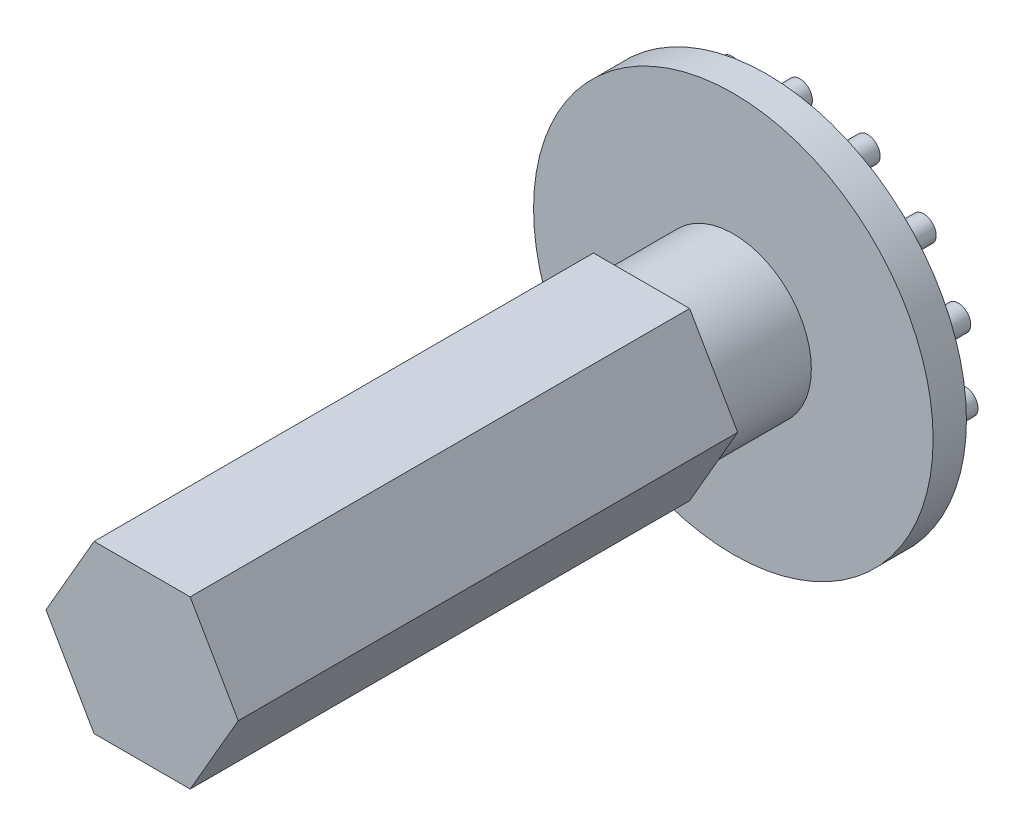
ISO-10303-21;
HEADER;
FILE_DESCRIPTION(('STEP AP214'),'2;1');
FILE_NAME('part.step','',(''),(''),'','','');
FILE_SCHEMA(('AUTOMOTIVE_DESIGN { 1 0 10303 214 1 1 1 1 }'));
ENDSEC;
DATA;
#1=APPLICATION_CONTEXT('core data for automotive mechanical design processes');
#2=APPLICATION_PROTOCOL_DEFINITION('international standard','automotive_design',2000,#1);
#3=PRODUCT_CONTEXT('',#1,'mechanical');
#4=PRODUCT('Part','Part','',(#3));
#5=PRODUCT_RELATED_PRODUCT_CATEGORY('part','',(#4));
#6=PRODUCT_DEFINITION_FORMATION('','',#4);
#7=PRODUCT_DEFINITION_CONTEXT('part definition',#1,'design');
#8=PRODUCT_DEFINITION('design','',#6,#7);
#9=PRODUCT_DEFINITION_SHAPE('','',#8);
#10=(LENGTH_UNIT() NAMED_UNIT(*) SI_UNIT(.MILLI.,.METRE.));
#11=(NAMED_UNIT(*) PLANE_ANGLE_UNIT() SI_UNIT($,.RADIAN.));
#12=(NAMED_UNIT(*) SI_UNIT($,.STERADIAN.) SOLID_ANGLE_UNIT());
#13=UNCERTAINTY_MEASURE_WITH_UNIT(LENGTH_MEASURE(1.E-05),#10,'distance_accuracy_value','');
#14=(GEOMETRIC_REPRESENTATION_CONTEXT(3) GLOBAL_UNCERTAINTY_ASSIGNED_CONTEXT((#13)) GLOBAL_UNIT_ASSIGNED_CONTEXT((#10,
#11,#12)) REPRESENTATION_CONTEXT('',''));
#15=CARTESIAN_POINT('',(0.,0.,0.));
#16=DIRECTION('',(0.,0.,1.));
#17=DIRECTION('',(1.,0.,0.));
#18=AXIS2_PLACEMENT_3D('',#15,#16,#17);
#19=CARTESIAN_POINT('',(0.,0.,2.54));
#20=DIRECTION('',(0.,0.,1.));
#21=DIRECTION('',(1.,0.,0.));
#22=AXIS2_PLACEMENT_3D('',#19,#20,#21);
#23=PLANE('',#22);
#24=CARTESIAN_POINT('',(0.,0.,2.54));
#25=DIRECTION('',(0.,0.,1.));
#26=DIRECTION('',(1.,0.,0.));
#27=AXIS2_PLACEMENT_3D('',#24,#25,#26);
#28=CIRCLE('',#27,5.95);
#29=CARTESIAN_POINT('',(5.95,0.,2.54));
#30=VERTEX_POINT('',#29);
#31=EDGE_CURVE('E172',#30,#30,#28,.T.);
#32=ORIENTED_EDGE('',*,*,#31,.F.);
#33=EDGE_LOOP('',(#32));
#34=FACE_BOUND('',#33,.T.);
#35=CARTESIAN_POINT('',(0.,0.,2.54));
#36=DIRECTION('',(0.,0.,1.));
#37=DIRECTION('',(1.,0.,0.));
#38=AXIS2_PLACEMENT_3D('',#35,#36,#37);
#39=CIRCLE('',#38,15.24);
#40=CARTESIAN_POINT('',(15.24,0.,2.54));
#41=VERTEX_POINT('',#40);
#42=EDGE_CURVE('E189',#41,#41,#39,.T.);
#43=ORIENTED_EDGE('',*,*,#42,.T.);
#44=EDGE_LOOP('',(#43));
#45=FACE_BOUND('',#44,.T.);
#46=ADVANCED_FACE('F47',(#34,#45),#23,.T.);
#47=CARTESIAN_POINT('',(0.,0.,0.));
#48=DIRECTION('',(0.,0.,1.));
#49=DIRECTION('',(1.,0.,0.));
#50=AXIS2_PLACEMENT_3D('',#47,#48,#49);
#51=PLANE('',#50);
#52=CARTESIAN_POINT('',(5.1655553670626,11.6020273120607,0.));
#53=DIRECTION('',(0.,0.,1.));
#54=DIRECTION('',(1.,0.,0.));
#55=AXIS2_PLACEMENT_3D('',#52,#53,#54);
#56=CIRCLE('',#55,0.952500000000296);
#57=CARTESIAN_POINT('',(6.1180553670629,11.6020273120607,0.));
#58=VERTEX_POINT('',#57);
#59=EDGE_CURVE('E11',#58,#58,#56,.F.);
#60=ORIENTED_EDGE('',*,*,#59,.F.);
#61=EDGE_LOOP('',(#60));
#62=FACE_BOUND('',#61,.T.);
#63=CARTESIAN_POINT('',(9.43793928356291,8.4979587007575,0.));
#64=DIRECTION('',(0.,0.,1.));
#65=DIRECTION('',(1.,0.,0.));
#66=AXIS2_PLACEMENT_3D('',#63,#64,#65);
#67=CIRCLE('',#66,0.952500000000151);
#68=CARTESIAN_POINT('',(10.3904392835631,8.4979587007575,0.));
#69=VERTEX_POINT('',#68);
#70=EDGE_CURVE('E57',#69,#69,#67,.F.);
#71=ORIENTED_EDGE('',*,*,#70,.F.);
#72=EDGE_LOOP('',(#71));
#73=FACE_BOUND('',#72,.T.);
#74=CARTESIAN_POINT('',(12.0784177569485,3.92451582856183,0.));
#75=DIRECTION('',(0.,0.,1.));
#76=DIRECTION('',(1.,0.,0.));
#77=AXIS2_PLACEMENT_3D('',#74,#75,#76);
#78=CIRCLE('',#77,0.95250000000013);
#79=CARTESIAN_POINT('',(13.0309177569486,3.92451582856183,0.));
#80=VERTEX_POINT('',#79);
#81=EDGE_CURVE('E238',#80,#80,#78,.F.);
#82=ORIENTED_EDGE('',*,*,#81,.F.);
#83=EDGE_LOOP('',(#82));
#84=FACE_BOUND('',#83,.T.);
#85=CARTESIAN_POINT('',(12.6304280711771,-1.32751148349921,0.));
#86=DIRECTION('',(0.,0.,1.));
#87=DIRECTION('',(1.,0.,0.));
#88=AXIS2_PLACEMENT_3D('',#85,#86,#87);
#89=CIRCLE('',#88,0.952500000000129);
#90=CARTESIAN_POINT('',(13.5829280711772,-1.32751148349921,0.));
#91=VERTEX_POINT('',#90);
#92=EDGE_CURVE('E235',#91,#91,#89,.F.);
#93=ORIENTED_EDGE('',*,*,#92,.F.);
#94=EDGE_LOOP('',(#93));
#95=FACE_BOUND('',#94,.T.);
#96=CARTESIAN_POINT('',(10.9985226280624,-6.35000000000001,0.));
#97=DIRECTION('',(0.,0.,1.));
#98=DIRECTION('',(1.,0.,0.));
#99=AXIS2_PLACEMENT_3D('',#96,#97,#98);
#100=CIRCLE('',#99,0.952500000000119);
#101=CARTESIAN_POINT('',(11.9510226280625,-6.35000000000001,0.));
#102=VERTEX_POINT('',#101);
#103=EDGE_CURVE('E232',#102,#102,#100,.F.);
#104=ORIENTED_EDGE('',*,*,#103,.F.);
#105=EDGE_LOOP('',(#104));
#106=FACE_BOUND('',#105,.T.);
#107=CARTESIAN_POINT('',(7.46487270411441,-10.2745158285618,0.));
#108=DIRECTION('',(0.,0.,1.));
#109=DIRECTION('',(1.,0.,0.));
#110=AXIS2_PLACEMENT_3D('',#107,#108,#109);
#111=CIRCLE('',#110,0.952500000000104);
#112=CARTESIAN_POINT('',(8.41737270411451,-10.2745158285618,0.));
#113=VERTEX_POINT('',#112);
#114=EDGE_CURVE('E229',#113,#113,#111,.F.);
#115=ORIENTED_EDGE('',*,*,#114,.F.);
#116=EDGE_LOOP('',(#115));
#117=FACE_BOUND('',#116,.T.);
#118=CARTESIAN_POINT('',(2.64047847338554,-12.4224745293193,0.));
#119=DIRECTION('',(0.,0.,1.));
#120=DIRECTION('',(1.,0.,0.));
#121=AXIS2_PLACEMENT_3D('',#118,#119,#120);
#122=CIRCLE('',#121,0.952500000000092);
#123=CARTESIAN_POINT('',(3.59297847338563,-12.4224745293193,0.));
#124=VERTEX_POINT('',#123);
#125=EDGE_CURVE('E226',#124,#124,#122,.F.);
#126=ORIENTED_EDGE('',*,*,#125,.F.);
#127=EDGE_LOOP('',(#126));
#128=FACE_BOUND('',#127,.T.);
#129=CARTESIAN_POINT('',(-2.64047847338555,-12.4224745293193,0.));
#130=DIRECTION('',(0.,0.,1.));
#131=DIRECTION('',(1.,0.,0.));
#132=AXIS2_PLACEMENT_3D('',#129,#130,#131);
#133=CIRCLE('',#132,0.95250000000008);
#134=CARTESIAN_POINT('',(-1.68797847338547,-12.4224745293193,0.));
#135=VERTEX_POINT('',#134);
#136=EDGE_CURVE('E223',#135,#135,#133,.F.);
#137=ORIENTED_EDGE('',*,*,#136,.F.);
#138=EDGE_LOOP('',(#137));
#139=FACE_BOUND('',#138,.T.);
#140=CARTESIAN_POINT('',(-7.46487270411441,-10.2745158285618,0.));
#141=DIRECTION('',(0.,0.,1.));
#142=DIRECTION('',(1.,0.,0.));
#143=AXIS2_PLACEMENT_3D('',#140,#141,#142);
#144=CIRCLE('',#143,0.952500000000065);
#145=CARTESIAN_POINT('',(-6.51237270411434,-10.2745158285618,0.));
#146=VERTEX_POINT('',#145);
#147=EDGE_CURVE('E220',#146,#146,#144,.F.);
#148=ORIENTED_EDGE('',*,*,#147,.F.);
#149=EDGE_LOOP('',(#148));
#150=FACE_BOUND('',#149,.T.);
#151=CARTESIAN_POINT('',(-10.9985226280624,-6.35,0.));
#152=DIRECTION('',(0.,0.,1.));
#153=DIRECTION('',(1.,0.,0.));
#154=AXIS2_PLACEMENT_3D('',#151,#152,#153);
#155=CIRCLE('',#154,0.952500000000058);
#156=CARTESIAN_POINT('',(-10.0460226280623,-6.35,0.));
#157=VERTEX_POINT('',#156);
#158=EDGE_CURVE('E216',#157,#157,#155,.F.);
#159=ORIENTED_EDGE('',*,*,#158,.F.);
#160=EDGE_LOOP('',(#159));
#161=FACE_BOUND('',#160,.T.);
#162=CARTESIAN_POINT('',(-12.6304280711771,-1.3275114834992,0.));
#163=DIRECTION('',(0.,0.,1.));
#164=DIRECTION('',(1.,0.,0.));
#165=AXIS2_PLACEMENT_3D('',#162,#163,#164);
#166=CIRCLE('',#165,0.952500000000045);
#167=CARTESIAN_POINT('',(-11.677928071177,-1.3275114834992,0.));
#168=VERTEX_POINT('',#167);
#169=EDGE_CURVE('E212',#168,#168,#166,.F.);
#170=ORIENTED_EDGE('',*,*,#169,.F.);
#171=EDGE_LOOP('',(#170));
#172=FACE_BOUND('',#171,.T.);
#173=CARTESIAN_POINT('',(-12.0784177569485,3.92451582856183,0.));
#174=DIRECTION('',(0.,0.,1.));
#175=DIRECTION('',(1.,0.,0.));
#176=AXIS2_PLACEMENT_3D('',#173,#174,#175);
#177=CIRCLE('',#176,0.952500000000032);
#178=CARTESIAN_POINT('',(-11.1259177569484,3.92451582856183,0.));
#179=VERTEX_POINT('',#178);
#180=EDGE_CURVE('E208',#179,#179,#177,.F.);
#181=ORIENTED_EDGE('',*,*,#180,.F.);
#182=EDGE_LOOP('',(#181));
#183=FACE_BOUND('',#182,.T.);
#184=CARTESIAN_POINT('',(-9.43793928356291,8.4979587007575,0.));
#185=DIRECTION('',(0.,0.,1.));
#186=DIRECTION('',(1.,0.,0.));
#187=AXIS2_PLACEMENT_3D('',#184,#185,#186);
#188=CIRCLE('',#187,0.952500000000023);
#189=CARTESIAN_POINT('',(-8.48543928356288,8.4979587007575,0.));
#190=VERTEX_POINT('',#189);
#191=EDGE_CURVE('E204',#190,#190,#188,.F.);
#192=ORIENTED_EDGE('',*,*,#191,.F.);
#193=EDGE_LOOP('',(#192));
#194=FACE_BOUND('',#193,.T.);
#195=CARTESIAN_POINT('',(-5.16555536706272,11.6020273120613,0.));
#196=DIRECTION('',(0.,0.,1.));
#197=DIRECTION('',(1.,0.,0.));
#198=AXIS2_PLACEMENT_3D('',#195,#196,#197);
#199=CIRCLE('',#198,0.952499999999985);
#200=CARTESIAN_POINT('',(-4.21305536706274,11.6020273120613,0.));
#201=VERTEX_POINT('',#200);
#202=EDGE_CURVE('E200',#201,#201,#199,.F.);
#203=ORIENTED_EDGE('',*,*,#202,.F.);
#204=EDGE_LOOP('',(#203));
#205=FACE_BOUND('',#204,.T.);
#206=CARTESIAN_POINT('',(0.,12.7,0.));
#207=DIRECTION('',(0.,0.,1.));
#208=DIRECTION('',(1.,0.,0.));
#209=AXIS2_PLACEMENT_3D('',#206,#207,#208);
#210=CIRCLE('',#209,0.9525);
#211=CARTESIAN_POINT('',(0.9525,12.7,0.));
#212=VERTEX_POINT('',#211);
#213=EDGE_CURVE('E193',#212,#212,#210,.F.);
#214=ORIENTED_EDGE('',*,*,#213,.F.);
#215=EDGE_LOOP('',(#214));
#216=FACE_BOUND('',#215,.T.);
#217=CARTESIAN_POINT('',(0.,0.,0.));
#218=DIRECTION('',(0.,0.,1.));
#219=DIRECTION('',(1.,0.,0.));
#220=AXIS2_PLACEMENT_3D('',#217,#218,#219);
#221=CIRCLE('',#220,15.24);
#222=CARTESIAN_POINT('',(15.24,0.,0.));
#223=VERTEX_POINT('',#222);
#224=EDGE_CURVE('E188',#223,#223,#221,.T.);
#225=ORIENTED_EDGE('',*,*,#224,.F.);
#226=EDGE_LOOP('',(#225));
#227=FACE_BOUND('',#226,.T.);
#228=CARTESIAN_POINT('',(0.,0.,0.));
#229=DIRECTION('',(0.,0.,1.));
#230=DIRECTION('',(1.,0.,0.));
#231=AXIS2_PLACEMENT_3D('',#228,#229,#230);
#232=CIRCLE('',#231,4.55);
#233=CARTESIAN_POINT('',(4.55,0.,0.));
#234=VERTEX_POINT('',#233);
#235=EDGE_CURVE('E184',#234,#234,#232,.T.);
#236=ORIENTED_EDGE('',*,*,#235,.T.);
#237=EDGE_LOOP('',(#236));
#238=FACE_BOUND('',#237,.T.);
#239=ADVANCED_FACE('F245',(#62,#73,#84,#95,#106,#117,#128,#139,#150,#161,#172,#183,#194,#205,
#216,#227,#238),#51,.F.);
#240=CARTESIAN_POINT('',(0.,0.,2.54));
#241=DIRECTION('',(0.,0.,-1.));
#242=DIRECTION('',(-1.,0.,0.));
#243=AXIS2_PLACEMENT_3D('',#240,#241,#242);
#244=CYLINDRICAL_SURFACE('',#243,15.24);
#245=ORIENTED_EDGE('',*,*,#42,.F.);
#246=EDGE_LOOP('',(#245));
#247=FACE_BOUND('',#246,.T.);
#248=ORIENTED_EDGE('',*,*,#224,.T.);
#249=EDGE_LOOP('',(#248));
#250=FACE_BOUND('',#249,.T.);
#251=ADVANCED_FACE('F49',(#247,#250),#244,.T.);
#252=CARTESIAN_POINT('',(0.,0.,2.54));
#253=DIRECTION('',(0.,0.,-1.));
#254=DIRECTION('',(-1.,0.,0.));
#255=AXIS2_PLACEMENT_3D('',#252,#253,#254);
#256=CYLINDRICAL_SURFACE('',#255,4.55);
#257=CARTESIAN_POINT('',(0.,0.,2.54));
#258=DIRECTION('',(0.,0.,1.));
#259=DIRECTION('',(1.,0.,0.));
#260=AXIS2_PLACEMENT_3D('',#257,#258,#259);
#261=CIRCLE('',#260,4.55);
#262=CARTESIAN_POINT('',(4.55,0.,2.54));
#263=VERTEX_POINT('',#262);
#264=EDGE_CURVE('E177',#263,#263,#261,.T.);
#265=ORIENTED_EDGE('',*,*,#264,.T.);
#266=EDGE_LOOP('',(#265));
#267=FACE_BOUND('',#266,.T.);
#268=ORIENTED_EDGE('',*,*,#235,.F.);
#269=EDGE_LOOP('',(#268));
#270=FACE_BOUND('',#269,.T.);
#271=ADVANCED_FACE('F279',(#267,#270),#256,.F.);
#272=CARTESIAN_POINT('',(0.,0.,2.54));
#273=DIRECTION('',(0.,0.,1.));
#274=DIRECTION('',(1.,0.,0.));
#275=AXIS2_PLACEMENT_3D('',#272,#273,#274);
#276=PLANE('',#275);
#277=ORIENTED_EDGE('',*,*,#264,.F.);
#278=EDGE_LOOP('',(#277));
#279=FACE_BOUND('',#278,.T.);
#280=ADVANCED_FACE('F281',(#279),#276,.F.);
#281=CARTESIAN_POINT('',(0.,0.,9.54));
#282=DIRECTION('',(0.,0.,-1.));
#283=DIRECTION('',(-1.,0.,0.));
#284=AXIS2_PLACEMENT_3D('',#281,#282,#283);
#285=CYLINDRICAL_SURFACE('',#284,5.95);
#286=CARTESIAN_POINT('',(0.,0.,9.54));
#287=DIRECTION('',(0.,0.,1.));
#288=DIRECTION('',(1.,0.,0.));
#289=AXIS2_PLACEMENT_3D('',#286,#287,#288);
#290=CIRCLE('',#289,5.95);
#291=CARTESIAN_POINT('',(5.95,0.,9.54));
#292=VERTEX_POINT('',#291);
#293=EDGE_CURVE('E173',#292,#292,#290,.T.);
#294=ORIENTED_EDGE('',*,*,#293,.F.);
#295=EDGE_LOOP('',(#294));
#296=FACE_BOUND('',#295,.T.);
#297=ORIENTED_EDGE('',*,*,#31,.T.);
#298=EDGE_LOOP('',(#297));
#299=FACE_BOUND('',#298,.T.);
#300=ADVANCED_FACE('F289',(#296,#299),#285,.T.);
#301=CARTESIAN_POINT('',(7.33234841870825,0.,47.64));
#302=DIRECTION('',(-0.866025403784439,-0.5,0.));
#303=DIRECTION('',(0.5,-0.866025403784438,0.));
#304=AXIS2_PLACEMENT_3D('',#301,#302,#303);
#305=PLANE('',#304);
#306=DIRECTION('',(-0.5,0.866025403784438,0.));
#307=VECTOR('',#306,1.);
#308=CARTESIAN_POINT('',(7.33234841870825,0.,9.54));
#309=LINE('',#308,#307);
#310=CARTESIAN_POINT('',(7.33234841870825,0.,9.54));
#311=VERTEX_POINT('',#310);
#312=CARTESIAN_POINT('',(3.66617420935412,6.35,9.54));
#313=VERTEX_POINT('',#312);
#314=EDGE_CURVE('E145',#311,#313,#309,.T.);
#315=ORIENTED_EDGE('',*,*,#314,.T.);
#316=DIRECTION('',(0.,0.,-1.));
#317=VECTOR('',#316,1.);
#318=CARTESIAN_POINT('',(3.66617420935412,6.35,47.64));
#319=LINE('',#318,#317);
#320=CARTESIAN_POINT('',(3.66617420935412,6.35,47.64));
#321=VERTEX_POINT('',#320);
#322=EDGE_CURVE('E169',#321,#313,#319,.T.);
#323=ORIENTED_EDGE('',*,*,#322,.F.);
#324=DIRECTION('',(-0.5,0.866025403784438,0.));
#325=VECTOR('',#324,1.);
#326=CARTESIAN_POINT('',(7.33234841870825,0.,47.64));
#327=LINE('',#326,#325);
#328=CARTESIAN_POINT('',(7.33234841870825,0.,47.64));
#329=VERTEX_POINT('',#328);
#330=EDGE_CURVE('E159',#329,#321,#327,.T.);
#331=ORIENTED_EDGE('',*,*,#330,.F.);
#332=DIRECTION('',(0.,0.,-1.));
#333=VECTOR('',#332,1.);
#334=CARTESIAN_POINT('',(7.33234841870825,0.,47.64));
#335=LINE('',#334,#333);
#336=EDGE_CURVE('E141',#329,#311,#335,.T.);
#337=ORIENTED_EDGE('',*,*,#336,.T.);
#338=EDGE_LOOP('',(#315,#323,#331,#337));
#339=FACE_BOUND('',#338,.T.);
#340=ADVANCED_FACE('F304',(#339),#305,.F.);
#341=CARTESIAN_POINT('',(3.66617420935412,6.35,47.64));
#342=DIRECTION('',(0.,-1.,0.));
#343=DIRECTION('',(1.,0.,0.));
#344=AXIS2_PLACEMENT_3D('',#341,#342,#343);
#345=PLANE('',#344);
#346=DIRECTION('',(-1.,0.,0.));
#347=VECTOR('',#346,1.);
#348=CARTESIAN_POINT('',(3.66617420935412,6.35,9.54));
#349=LINE('',#348,#347);
#350=CARTESIAN_POINT('',(-3.66617420935412,6.35,9.54));
#351=VERTEX_POINT('',#350);
#352=EDGE_CURVE('E148',#313,#351,#349,.T.);
#353=ORIENTED_EDGE('',*,*,#352,.T.);
#354=DIRECTION('',(0.,0.,-1.));
#355=VECTOR('',#354,1.);
#356=CARTESIAN_POINT('',(-3.66617420935412,6.35,47.64));
#357=LINE('',#356,#355);
#358=CARTESIAN_POINT('',(-3.66617420935412,6.35,47.64));
#359=VERTEX_POINT('',#358);
#360=EDGE_CURVE('E165',#359,#351,#357,.T.);
#361=ORIENTED_EDGE('',*,*,#360,.F.);
#362=DIRECTION('',(-1.,0.,0.));
#363=VECTOR('',#362,1.);
#364=CARTESIAN_POINT('',(3.66617420935412,6.35,47.64));
#365=LINE('',#364,#363);
#366=EDGE_CURVE('E109',#321,#359,#365,.T.);
#367=ORIENTED_EDGE('',*,*,#366,.F.);
#368=ORIENTED_EDGE('',*,*,#322,.T.);
#369=EDGE_LOOP('',(#353,#361,#367,#368));
#370=FACE_BOUND('',#369,.T.);
#371=ADVANCED_FACE('F309',(#370),#345,.F.);
#372=CARTESIAN_POINT('',(-3.66617420935412,6.35,47.64));
#373=DIRECTION('',(0.866025403784439,-0.5,0.));
#374=DIRECTION('',(0.5,0.866025403784439,0.));
#375=AXIS2_PLACEMENT_3D('',#372,#373,#374);
#376=PLANE('',#375);
#377=DIRECTION('',(-0.5,-0.866025403784439,0.));
#378=VECTOR('',#377,1.);
#379=CARTESIAN_POINT('',(-3.66617420935412,6.35,9.54));
#380=LINE('',#379,#378);
#381=CARTESIAN_POINT('',(-7.33234841870824,0.,9.54));
#382=VERTEX_POINT('',#381);
#383=EDGE_CURVE('E152',#351,#382,#380,.T.);
#384=ORIENTED_EDGE('',*,*,#383,.T.);
#385=DIRECTION('',(0.,0.,-1.));
#386=VECTOR('',#385,1.);
#387=CARTESIAN_POINT('',(-7.33234841870824,0.,47.64));
#388=LINE('',#387,#386);
#389=CARTESIAN_POINT('',(-7.33234841870824,0.,47.64));
#390=VERTEX_POINT('',#389);
#391=EDGE_CURVE('E133',#390,#382,#388,.T.);
#392=ORIENTED_EDGE('',*,*,#391,.F.);
#393=DIRECTION('',(-0.5,-0.866025403784439,0.));
#394=VECTOR('',#393,1.);
#395=CARTESIAN_POINT('',(-3.66617420935412,6.35,47.64));
#396=LINE('',#395,#394);
#397=EDGE_CURVE('E123',#359,#390,#396,.T.);
#398=ORIENTED_EDGE('',*,*,#397,.F.);
#399=ORIENTED_EDGE('',*,*,#360,.T.);
#400=EDGE_LOOP('',(#384,#392,#398,#399));
#401=FACE_BOUND('',#400,.T.);
#402=ADVANCED_FACE('F316',(#401),#376,.F.);
#403=CARTESIAN_POINT('',(-7.33234841870824,0.,47.64));
#404=DIRECTION('',(0.866025403784439,0.5,0.));
#405=DIRECTION('',(-0.5,0.866025403784438,0.));
#406=AXIS2_PLACEMENT_3D('',#403,#404,#405);
#407=PLANE('',#406);
#408=DIRECTION('',(0.5,-0.866025403784438,0.));
#409=VECTOR('',#408,1.);
#410=CARTESIAN_POINT('',(-7.33234841870824,0.,9.54));
#411=LINE('',#410,#409);
#412=CARTESIAN_POINT('',(-3.66617420935412,-6.35,9.54));
#413=VERTEX_POINT('',#412);
#414=EDGE_CURVE('E132',#382,#413,#411,.T.);
#415=ORIENTED_EDGE('',*,*,#414,.T.);
#416=DIRECTION('',(0.,0.,-1.));
#417=VECTOR('',#416,1.);
#418=CARTESIAN_POINT('',(-3.66617420935412,-6.35,47.64));
#419=LINE('',#418,#417);
#420=CARTESIAN_POINT('',(-3.66617420935412,-6.35,47.64));
#421=VERTEX_POINT('',#420);
#422=EDGE_CURVE('E129',#421,#413,#419,.T.);
#423=ORIENTED_EDGE('',*,*,#422,.F.);
#424=DIRECTION('',(0.5,-0.866025403784438,0.));
#425=VECTOR('',#424,1.);
#426=CARTESIAN_POINT('',(-7.33234841870824,0.,47.64));
#427=LINE('',#426,#425);
#428=EDGE_CURVE('E117',#390,#421,#427,.T.);
#429=ORIENTED_EDGE('',*,*,#428,.F.);
#430=ORIENTED_EDGE('',*,*,#391,.T.);
#431=EDGE_LOOP('',(#415,#423,#429,#430));
#432=FACE_BOUND('',#431,.T.);
#433=ADVANCED_FACE('F130',(#432),#407,.F.);
#434=CARTESIAN_POINT('',(-3.66617420935412,-6.35,47.64));
#435=DIRECTION('',(0.,1.,0.));
#436=DIRECTION('',(-1.,0.,0.));
#437=AXIS2_PLACEMENT_3D('',#434,#435,#436);
#438=PLANE('',#437);
#439=DIRECTION('',(1.,0.,0.));
#440=VECTOR('',#439,1.);
#441=CARTESIAN_POINT('',(-3.66617420935412,-6.35,9.54));
#442=LINE('',#441,#440);
#443=CARTESIAN_POINT('',(3.66617420935413,-6.35,9.54));
#444=VERTEX_POINT('',#443);
#445=EDGE_CURVE('E93',#413,#444,#442,.T.);
#446=ORIENTED_EDGE('',*,*,#445,.T.);
#447=DIRECTION('',(0.,0.,-1.));
#448=VECTOR('',#447,1.);
#449=CARTESIAN_POINT('',(3.66617420935413,-6.35,47.64));
#450=LINE('',#449,#448);
#451=CARTESIAN_POINT('',(3.66617420935413,-6.35,47.64));
#452=VERTEX_POINT('',#451);
#453=EDGE_CURVE('E134',#452,#444,#450,.T.);
#454=ORIENTED_EDGE('',*,*,#453,.F.);
#455=DIRECTION('',(1.,0.,0.));
#456=VECTOR('',#455,1.);
#457=CARTESIAN_POINT('',(-3.66617420935412,-6.35,47.64));
#458=LINE('',#457,#456);
#459=EDGE_CURVE('E121',#421,#452,#458,.T.);
#460=ORIENTED_EDGE('',*,*,#459,.F.);
#461=ORIENTED_EDGE('',*,*,#422,.T.);
#462=EDGE_LOOP('',(#446,#454,#460,#461));
#463=FACE_BOUND('',#462,.T.);
#464=ADVANCED_FACE('F136',(#463),#438,.F.);
#465=CARTESIAN_POINT('',(3.66617420935413,-6.35,47.64));
#466=DIRECTION('',(-0.866025403784439,0.5,0.));
#467=DIRECTION('',(-0.5,-0.866025403784439,0.));
#468=AXIS2_PLACEMENT_3D('',#465,#466,#467);
#469=PLANE('',#468);
#470=DIRECTION('',(0.5,0.866025403784439,0.));
#471=VECTOR('',#470,1.);
#472=CARTESIAN_POINT('',(3.66617420935413,-6.35,9.54));
#473=LINE('',#472,#471);
#474=EDGE_CURVE('E99',#444,#311,#473,.T.);
#475=ORIENTED_EDGE('',*,*,#474,.T.);
#476=ORIENTED_EDGE('',*,*,#336,.F.);
#477=DIRECTION('',(0.5,0.866025403784439,0.));
#478=VECTOR('',#477,1.);
#479=CARTESIAN_POINT('',(3.66617420935413,-6.35,47.64));
#480=LINE('',#479,#478);
#481=EDGE_CURVE('E68',#452,#329,#480,.T.);
#482=ORIENTED_EDGE('',*,*,#481,.F.);
#483=ORIENTED_EDGE('',*,*,#453,.T.);
#484=EDGE_LOOP('',(#475,#476,#482,#483));
#485=FACE_BOUND('',#484,.T.);
#486=ADVANCED_FACE('F324',(#485),#469,.F.);
#487=CARTESIAN_POINT('',(0.,0.,47.64));
#488=DIRECTION('',(0.,0.,1.));
#489=DIRECTION('',(1.,0.,0.));
#490=AXIS2_PLACEMENT_3D('',#487,#488,#489);
#491=PLANE('',#490);
#492=ORIENTED_EDGE('',*,*,#330,.T.);
#493=ORIENTED_EDGE('',*,*,#366,.T.);
#494=ORIENTED_EDGE('',*,*,#397,.T.);
#495=ORIENTED_EDGE('',*,*,#428,.T.);
#496=ORIENTED_EDGE('',*,*,#459,.T.);
#497=ORIENTED_EDGE('',*,*,#481,.T.);
#498=EDGE_LOOP('',(#492,#493,#494,#495,#496,#497));
#499=FACE_BOUND('',#498,.T.);
#500=ADVANCED_FACE('F119',(#499),#491,.T.);
#501=CARTESIAN_POINT('',(0.,0.,9.54));
#502=DIRECTION('',(0.,0.,1.));
#503=DIRECTION('',(1.,0.,0.));
#504=AXIS2_PLACEMENT_3D('',#501,#502,#503);
#505=PLANE('',#504);
#506=ORIENTED_EDGE('',*,*,#293,.T.);
#507=EDGE_LOOP('',(#506));
#508=FACE_BOUND('',#507,.T.);
#509=ORIENTED_EDGE('',*,*,#314,.F.);
#510=ORIENTED_EDGE('',*,*,#474,.F.);
#511=ORIENTED_EDGE('',*,*,#445,.F.);
#512=ORIENTED_EDGE('',*,*,#414,.F.);
#513=ORIENTED_EDGE('',*,*,#383,.F.);
#514=ORIENTED_EDGE('',*,*,#352,.F.);
#515=EDGE_LOOP('',(#509,#510,#511,#512,#513,#514));
#516=FACE_BOUND('',#515,.T.);
#517=ADVANCED_FACE('F327',(#508,#516),#505,.F.);
#518=CARTESIAN_POINT('',(0.,12.7,-2.54));
#519=DIRECTION('',(0.,0.,1.));
#520=DIRECTION('',(1.,0.,0.));
#521=AXIS2_PLACEMENT_3D('',#518,#519,#520);
#522=CYLINDRICAL_SURFACE('',#521,0.9525);
#523=CARTESIAN_POINT('',(0.,12.7,-2.54));
#524=DIRECTION('',(0.,0.,-1.));
#525=DIRECTION('',(-1.,0.,0.));
#526=AXIS2_PLACEMENT_3D('',#523,#524,#525);
#527=CIRCLE('',#526,0.9525);
#528=CARTESIAN_POINT('',(-0.9525,12.7,-2.54));
#529=VERTEX_POINT('',#528);
#530=EDGE_CURVE('E149',#529,#529,#527,.T.);
#531=ORIENTED_EDGE('',*,*,#530,.F.);
#532=EDGE_LOOP('',(#531));
#533=FACE_BOUND('',#532,.T.);
#534=ORIENTED_EDGE('',*,*,#213,.T.);
#535=EDGE_LOOP('',(#534));
#536=FACE_BOUND('',#535,.T.);
#537=ADVANCED_FACE('F330',(#533,#536),#522,.T.);
#538=CARTESIAN_POINT('',(0.,12.7,-2.54));
#539=DIRECTION('',(0.,0.,-1.));
#540=DIRECTION('',(-1.,0.,0.));
#541=AXIS2_PLACEMENT_3D('',#538,#539,#540);
#542=PLANE('',#541);
#543=ORIENTED_EDGE('',*,*,#530,.T.);
#544=EDGE_LOOP('',(#543));
#545=FACE_BOUND('',#544,.T.);
#546=ADVANCED_FACE('F336',(#545),#542,.T.);
#547=CARTESIAN_POINT('',(-5.16555536706272,11.6020273120613,-2.54));
#548=DIRECTION('',(0.,0.,1.));
#549=DIRECTION('',(1.,0.,0.));
#550=AXIS2_PLACEMENT_3D('',#547,#548,#549);
#551=CYLINDRICAL_SURFACE('',#550,0.952499999999985);
#552=CARTESIAN_POINT('',(-5.16555536706272,11.6020273120613,-2.54));
#553=DIRECTION('',(0.,0.,-1.));
#554=DIRECTION('',(-1.,0.,0.));
#555=AXIS2_PLACEMENT_3D('',#552,#553,#554);
#556=CIRCLE('',#555,0.952499999999985);
#557=CARTESIAN_POINT('',(-6.11805536706271,11.6020273120613,-2.54));
#558=VERTEX_POINT('',#557);
#559=EDGE_CURVE('E502',#558,#558,#556,.T.);
#560=ORIENTED_EDGE('',*,*,#559,.F.);
#561=EDGE_LOOP('',(#560));
#562=FACE_BOUND('',#561,.T.);
#563=ORIENTED_EDGE('',*,*,#202,.T.);
#564=EDGE_LOOP('',(#563));
#565=FACE_BOUND('',#564,.T.);
#566=ADVANCED_FACE('F340',(#562,#565),#551,.T.);
#567=CARTESIAN_POINT('',(-5.16555536706272,11.6020273120613,-2.54));
#568=DIRECTION('',(0.,0.,-1.));
#569=DIRECTION('',(-1.,0.,0.));
#570=AXIS2_PLACEMENT_3D('',#567,#568,#569);
#571=PLANE('',#570);
#572=ORIENTED_EDGE('',*,*,#559,.T.);
#573=EDGE_LOOP('',(#572));
#574=FACE_BOUND('',#573,.T.);
#575=ADVANCED_FACE('F342',(#574),#571,.T.);
#576=CARTESIAN_POINT('',(-9.43793928356291,8.4979587007575,-2.54));
#577=DIRECTION('',(0.,0.,1.));
#578=DIRECTION('',(1.,0.,0.));
#579=AXIS2_PLACEMENT_3D('',#576,#577,#578);
#580=CYLINDRICAL_SURFACE('',#579,0.952500000000023);
#581=CARTESIAN_POINT('',(-9.43793928356291,8.4979587007575,-2.54));
#582=DIRECTION('',(0.,0.,-1.));
#583=DIRECTION('',(-1.,0.,0.));
#584=AXIS2_PLACEMENT_3D('',#581,#582,#583);
#585=CIRCLE('',#584,0.952500000000023);
#586=CARTESIAN_POINT('',(-10.3904392835629,8.4979587007575,-2.54));
#587=VERTEX_POINT('',#586);
#588=EDGE_CURVE('E498',#587,#587,#585,.T.);
#589=ORIENTED_EDGE('',*,*,#588,.F.);
#590=EDGE_LOOP('',(#589));
#591=FACE_BOUND('',#590,.T.);
#592=ORIENTED_EDGE('',*,*,#191,.T.);
#593=EDGE_LOOP('',(#592));
#594=FACE_BOUND('',#593,.T.);
#595=ADVANCED_FACE('F345',(#591,#594),#580,.T.);
#596=CARTESIAN_POINT('',(-9.43793928356291,8.4979587007575,-2.54));
#597=DIRECTION('',(0.,0.,-1.));
#598=DIRECTION('',(-1.,0.,0.));
#599=AXIS2_PLACEMENT_3D('',#596,#597,#598);
#600=PLANE('',#599);
#601=ORIENTED_EDGE('',*,*,#588,.T.);
#602=EDGE_LOOP('',(#601));
#603=FACE_BOUND('',#602,.T.);
#604=ADVANCED_FACE('F350',(#603),#600,.T.);
#605=CARTESIAN_POINT('',(-12.0784177569485,3.92451582856183,-2.54));
#606=DIRECTION('',(0.,0.,1.));
#607=DIRECTION('',(1.,0.,0.));
#608=AXIS2_PLACEMENT_3D('',#605,#606,#607);
#609=CYLINDRICAL_SURFACE('',#608,0.952500000000032);
#610=CARTESIAN_POINT('',(-12.0784177569485,3.92451582856183,-2.54));
#611=DIRECTION('',(0.,0.,-1.));
#612=DIRECTION('',(-1.,0.,0.));
#613=AXIS2_PLACEMENT_3D('',#610,#611,#612);
#614=CIRCLE('',#613,0.952500000000032);
#615=CARTESIAN_POINT('',(-13.0309177569485,3.92451582856183,-2.54));
#616=VERTEX_POINT('',#615);
#617=EDGE_CURVE('E494',#616,#616,#614,.T.);
#618=ORIENTED_EDGE('',*,*,#617,.F.);
#619=EDGE_LOOP('',(#618));
#620=FACE_BOUND('',#619,.T.);
#621=ORIENTED_EDGE('',*,*,#180,.T.);
#622=EDGE_LOOP('',(#621));
#623=FACE_BOUND('',#622,.T.);
#624=ADVANCED_FACE('F353',(#620,#623),#609,.T.);
#625=CARTESIAN_POINT('',(-12.0784177569485,3.92451582856183,-2.54));
#626=DIRECTION('',(0.,0.,-1.));
#627=DIRECTION('',(-1.,0.,0.));
#628=AXIS2_PLACEMENT_3D('',#625,#626,#627);
#629=PLANE('',#628);
#630=ORIENTED_EDGE('',*,*,#617,.T.);
#631=EDGE_LOOP('',(#630));
#632=FACE_BOUND('',#631,.T.);
#633=ADVANCED_FACE('F358',(#632),#629,.T.);
#634=CARTESIAN_POINT('',(-12.6304280711771,-1.3275114834992,-2.54));
#635=DIRECTION('',(0.,0.,1.));
#636=DIRECTION('',(1.,0.,0.));
#637=AXIS2_PLACEMENT_3D('',#634,#635,#636);
#638=CYLINDRICAL_SURFACE('',#637,0.952500000000045);
#639=CARTESIAN_POINT('',(-12.6304280711771,-1.3275114834992,-2.54));
#640=DIRECTION('',(0.,0.,-1.));
#641=DIRECTION('',(-1.,0.,0.));
#642=AXIS2_PLACEMENT_3D('',#639,#640,#641);
#643=CIRCLE('',#642,0.952500000000045);
#644=CARTESIAN_POINT('',(-13.5829280711771,-1.3275114834992,-2.54));
#645=VERTEX_POINT('',#644);
#646=EDGE_CURVE('E490',#645,#645,#643,.T.);
#647=ORIENTED_EDGE('',*,*,#646,.F.);
#648=EDGE_LOOP('',(#647));
#649=FACE_BOUND('',#648,.T.);
#650=ORIENTED_EDGE('',*,*,#169,.T.);
#651=EDGE_LOOP('',(#650));
#652=FACE_BOUND('',#651,.T.);
#653=ADVANCED_FACE('F361',(#649,#652),#638,.T.);
#654=CARTESIAN_POINT('',(-12.6304280711771,-1.3275114834992,-2.54));
#655=DIRECTION('',(0.,0.,-1.));
#656=DIRECTION('',(-1.,0.,0.));
#657=AXIS2_PLACEMENT_3D('',#654,#655,#656);
#658=PLANE('',#657);
#659=ORIENTED_EDGE('',*,*,#646,.T.);
#660=EDGE_LOOP('',(#659));
#661=FACE_BOUND('',#660,.T.);
#662=ADVANCED_FACE('F366',(#661),#658,.T.);
#663=CARTESIAN_POINT('',(-10.9985226280624,-6.35,-2.54));
#664=DIRECTION('',(0.,0.,1.));
#665=DIRECTION('',(1.,0.,0.));
#666=AXIS2_PLACEMENT_3D('',#663,#664,#665);
#667=CYLINDRICAL_SURFACE('',#666,0.952500000000058);
#668=CARTESIAN_POINT('',(-10.9985226280624,-6.35,-2.54));
#669=DIRECTION('',(0.,0.,-1.));
#670=DIRECTION('',(-1.,0.,0.));
#671=AXIS2_PLACEMENT_3D('',#668,#669,#670);
#672=CIRCLE('',#671,0.952500000000058);
#673=CARTESIAN_POINT('',(-11.9510226280624,-6.35,-2.54));
#674=VERTEX_POINT('',#673);
#675=EDGE_CURVE('E486',#674,#674,#672,.T.);
#676=ORIENTED_EDGE('',*,*,#675,.F.);
#677=EDGE_LOOP('',(#676));
#678=FACE_BOUND('',#677,.T.);
#679=ORIENTED_EDGE('',*,*,#158,.T.);
#680=EDGE_LOOP('',(#679));
#681=FACE_BOUND('',#680,.T.);
#682=ADVANCED_FACE('F369',(#678,#681),#667,.T.);
#683=CARTESIAN_POINT('',(-10.9985226280624,-6.35,-2.54));
#684=DIRECTION('',(0.,0.,-1.));
#685=DIRECTION('',(-1.,0.,0.));
#686=AXIS2_PLACEMENT_3D('',#683,#684,#685);
#687=PLANE('',#686);
#688=ORIENTED_EDGE('',*,*,#675,.T.);
#689=EDGE_LOOP('',(#688));
#690=FACE_BOUND('',#689,.T.);
#691=ADVANCED_FACE('F374',(#690),#687,.T.);
#692=CARTESIAN_POINT('',(-7.46487270411441,-10.2745158285618,-2.54));
#693=DIRECTION('',(0.,0.,1.));
#694=DIRECTION('',(1.,0.,0.));
#695=AXIS2_PLACEMENT_3D('',#692,#693,#694);
#696=CYLINDRICAL_SURFACE('',#695,0.952500000000065);
#697=CARTESIAN_POINT('',(-7.46487270411441,-10.2745158285618,-2.54));
#698=DIRECTION('',(0.,0.,-1.));
#699=DIRECTION('',(-1.,0.,0.));
#700=AXIS2_PLACEMENT_3D('',#697,#698,#699);
#701=CIRCLE('',#700,0.952500000000065);
#702=CARTESIAN_POINT('',(-8.41737270411447,-10.2745158285618,-2.54));
#703=VERTEX_POINT('',#702);
#704=EDGE_CURVE('E483',#703,#703,#701,.T.);
#705=ORIENTED_EDGE('',*,*,#704,.F.);
#706=EDGE_LOOP('',(#705));
#707=FACE_BOUND('',#706,.T.);
#708=ORIENTED_EDGE('',*,*,#147,.T.);
#709=EDGE_LOOP('',(#708));
#710=FACE_BOUND('',#709,.T.);
#711=ADVANCED_FACE('F377',(#707,#710),#696,.T.);
#712=CARTESIAN_POINT('',(-7.46487270411441,-10.2745158285618,-2.54));
#713=DIRECTION('',(0.,0.,-1.));
#714=DIRECTION('',(-1.,0.,0.));
#715=AXIS2_PLACEMENT_3D('',#712,#713,#714);
#716=PLANE('',#715);
#717=ORIENTED_EDGE('',*,*,#704,.T.);
#718=EDGE_LOOP('',(#717));
#719=FACE_BOUND('',#718,.T.);
#720=ADVANCED_FACE('F382',(#719),#716,.T.);
#721=CARTESIAN_POINT('',(-2.64047847338555,-12.4224745293193,-2.54));
#722=DIRECTION('',(0.,0.,1.));
#723=DIRECTION('',(1.,0.,0.));
#724=AXIS2_PLACEMENT_3D('',#721,#722,#723);
#725=CYLINDRICAL_SURFACE('',#724,0.95250000000008);
#726=CARTESIAN_POINT('',(-2.64047847338555,-12.4224745293193,-2.54));
#727=DIRECTION('',(0.,0.,-1.));
#728=DIRECTION('',(-1.,0.,0.));
#729=AXIS2_PLACEMENT_3D('',#726,#727,#728);
#730=CIRCLE('',#729,0.95250000000008);
#731=CARTESIAN_POINT('',(-3.59297847338563,-12.4224745293193,-2.54));
#732=VERTEX_POINT('',#731);
#733=EDGE_CURVE('E480',#732,#732,#730,.T.);
#734=ORIENTED_EDGE('',*,*,#733,.F.);
#735=EDGE_LOOP('',(#734));
#736=FACE_BOUND('',#735,.T.);
#737=ORIENTED_EDGE('',*,*,#136,.T.);
#738=EDGE_LOOP('',(#737));
#739=FACE_BOUND('',#738,.T.);
#740=ADVANCED_FACE('F385',(#736,#739),#725,.T.);
#741=CARTESIAN_POINT('',(-2.64047847338555,-12.4224745293193,-2.54));
#742=DIRECTION('',(0.,0.,-1.));
#743=DIRECTION('',(-1.,0.,0.));
#744=AXIS2_PLACEMENT_3D('',#741,#742,#743);
#745=PLANE('',#744);
#746=ORIENTED_EDGE('',*,*,#733,.T.);
#747=EDGE_LOOP('',(#746));
#748=FACE_BOUND('',#747,.T.);
#749=ADVANCED_FACE('F390',(#748),#745,.T.);
#750=CARTESIAN_POINT('',(2.64047847338554,-12.4224745293193,-2.54));
#751=DIRECTION('',(0.,0.,1.));
#752=DIRECTION('',(1.,0.,0.));
#753=AXIS2_PLACEMENT_3D('',#750,#751,#752);
#754=CYLINDRICAL_SURFACE('',#753,0.952500000000092);
#755=CARTESIAN_POINT('',(2.64047847338554,-12.4224745293193,-2.54));
#756=DIRECTION('',(0.,0.,-1.));
#757=DIRECTION('',(-1.,0.,0.));
#758=AXIS2_PLACEMENT_3D('',#755,#756,#757);
#759=CIRCLE('',#758,0.952500000000092);
#760=CARTESIAN_POINT('',(1.68797847338545,-12.4224745293193,-2.54));
#761=VERTEX_POINT('',#760);
#762=EDGE_CURVE('E477',#761,#761,#759,.T.);
#763=ORIENTED_EDGE('',*,*,#762,.F.);
#764=EDGE_LOOP('',(#763));
#765=FACE_BOUND('',#764,.T.);
#766=ORIENTED_EDGE('',*,*,#125,.T.);
#767=EDGE_LOOP('',(#766));
#768=FACE_BOUND('',#767,.T.);
#769=ADVANCED_FACE('F393',(#765,#768),#754,.T.);
#770=CARTESIAN_POINT('',(2.64047847338554,-12.4224745293193,-2.54));
#771=DIRECTION('',(0.,0.,-1.));
#772=DIRECTION('',(-1.,0.,0.));
#773=AXIS2_PLACEMENT_3D('',#770,#771,#772);
#774=PLANE('',#773);
#775=ORIENTED_EDGE('',*,*,#762,.T.);
#776=EDGE_LOOP('',(#775));
#777=FACE_BOUND('',#776,.T.);
#778=ADVANCED_FACE('F398',(#777),#774,.T.);
#779=CARTESIAN_POINT('',(7.46487270411441,-10.2745158285618,-2.54));
#780=DIRECTION('',(0.,0.,1.));
#781=DIRECTION('',(1.,0.,0.));
#782=AXIS2_PLACEMENT_3D('',#779,#780,#781);
#783=CYLINDRICAL_SURFACE('',#782,0.952500000000104);
#784=CARTESIAN_POINT('',(7.46487270411441,-10.2745158285618,-2.54));
#785=DIRECTION('',(0.,0.,-1.));
#786=DIRECTION('',(-1.,0.,0.));
#787=AXIS2_PLACEMENT_3D('',#784,#785,#786);
#788=CIRCLE('',#787,0.952500000000104);
#789=CARTESIAN_POINT('',(6.5123727041143,-10.2745158285618,-2.54));
#790=VERTEX_POINT('',#789);
#791=EDGE_CURVE('E474',#790,#790,#788,.T.);
#792=ORIENTED_EDGE('',*,*,#791,.F.);
#793=EDGE_LOOP('',(#792));
#794=FACE_BOUND('',#793,.T.);
#795=ORIENTED_EDGE('',*,*,#114,.T.);
#796=EDGE_LOOP('',(#795));
#797=FACE_BOUND('',#796,.T.);
#798=ADVANCED_FACE('F401',(#794,#797),#783,.T.);
#799=CARTESIAN_POINT('',(7.46487270411441,-10.2745158285618,-2.54));
#800=DIRECTION('',(0.,0.,-1.));
#801=DIRECTION('',(-1.,0.,0.));
#802=AXIS2_PLACEMENT_3D('',#799,#800,#801);
#803=PLANE('',#802);
#804=ORIENTED_EDGE('',*,*,#791,.T.);
#805=EDGE_LOOP('',(#804));
#806=FACE_BOUND('',#805,.T.);
#807=ADVANCED_FACE('F406',(#806),#803,.T.);
#808=CARTESIAN_POINT('',(10.9985226280624,-6.35000000000001,-2.54));
#809=DIRECTION('',(0.,0.,1.));
#810=DIRECTION('',(1.,0.,0.));
#811=AXIS2_PLACEMENT_3D('',#808,#809,#810);
#812=CYLINDRICAL_SURFACE('',#811,0.952500000000119);
#813=CARTESIAN_POINT('',(10.9985226280624,-6.35000000000001,-2.54));
#814=DIRECTION('',(0.,0.,-1.));
#815=DIRECTION('',(-1.,0.,0.));
#816=AXIS2_PLACEMENT_3D('',#813,#814,#815);
#817=CIRCLE('',#816,0.952500000000119);
#818=CARTESIAN_POINT('',(10.0460226280622,-6.35000000000001,-2.54));
#819=VERTEX_POINT('',#818);
#820=EDGE_CURVE('E471',#819,#819,#817,.T.);
#821=ORIENTED_EDGE('',*,*,#820,.F.);
#822=EDGE_LOOP('',(#821));
#823=FACE_BOUND('',#822,.T.);
#824=ORIENTED_EDGE('',*,*,#103,.T.);
#825=EDGE_LOOP('',(#824));
#826=FACE_BOUND('',#825,.T.);
#827=ADVANCED_FACE('F409',(#823,#826),#812,.T.);
#828=CARTESIAN_POINT('',(10.9985226280624,-6.35000000000001,-2.54));
#829=DIRECTION('',(0.,0.,-1.));
#830=DIRECTION('',(-1.,0.,0.));
#831=AXIS2_PLACEMENT_3D('',#828,#829,#830);
#832=PLANE('',#831);
#833=ORIENTED_EDGE('',*,*,#820,.T.);
#834=EDGE_LOOP('',(#833));
#835=FACE_BOUND('',#834,.T.);
#836=ADVANCED_FACE('F414',(#835),#832,.T.);
#837=CARTESIAN_POINT('',(12.6304280711771,-1.32751148349921,-2.54));
#838=DIRECTION('',(0.,0.,1.));
#839=DIRECTION('',(1.,0.,0.));
#840=AXIS2_PLACEMENT_3D('',#837,#838,#839);
#841=CYLINDRICAL_SURFACE('',#840,0.952500000000129);
#842=CARTESIAN_POINT('',(12.6304280711771,-1.32751148349921,-2.54));
#843=DIRECTION('',(0.,0.,-1.));
#844=DIRECTION('',(-1.,0.,0.));
#845=AXIS2_PLACEMENT_3D('',#842,#843,#844);
#846=CIRCLE('',#845,0.952500000000129);
#847=CARTESIAN_POINT('',(11.6779280711769,-1.32751148349921,-2.54));
#848=VERTEX_POINT('',#847);
#849=EDGE_CURVE('E468',#848,#848,#846,.T.);
#850=ORIENTED_EDGE('',*,*,#849,.F.);
#851=EDGE_LOOP('',(#850));
#852=FACE_BOUND('',#851,.T.);
#853=ORIENTED_EDGE('',*,*,#92,.T.);
#854=EDGE_LOOP('',(#853));
#855=FACE_BOUND('',#854,.T.);
#856=ADVANCED_FACE('F417',(#852,#855),#841,.T.);
#857=CARTESIAN_POINT('',(12.6304280711771,-1.32751148349921,-2.54));
#858=DIRECTION('',(0.,0.,-1.));
#859=DIRECTION('',(-1.,0.,0.));
#860=AXIS2_PLACEMENT_3D('',#857,#858,#859);
#861=PLANE('',#860);
#862=ORIENTED_EDGE('',*,*,#849,.T.);
#863=EDGE_LOOP('',(#862));
#864=FACE_BOUND('',#863,.T.);
#865=ADVANCED_FACE('F422',(#864),#861,.T.);
#866=CARTESIAN_POINT('',(12.0784177569485,3.92451582856183,-2.54));
#867=DIRECTION('',(0.,0.,1.));
#868=DIRECTION('',(1.,0.,0.));
#869=AXIS2_PLACEMENT_3D('',#866,#867,#868);
#870=CYLINDRICAL_SURFACE('',#869,0.95250000000013);
#871=CARTESIAN_POINT('',(12.0784177569485,3.92451582856183,-2.54));
#872=DIRECTION('',(0.,0.,-1.));
#873=DIRECTION('',(-1.,0.,0.));
#874=AXIS2_PLACEMENT_3D('',#871,#872,#873);
#875=CIRCLE('',#874,0.95250000000013);
#876=CARTESIAN_POINT('',(11.1259177569483,3.92451582856183,-2.54));
#877=VERTEX_POINT('',#876);
#878=EDGE_CURVE('E463',#877,#877,#875,.T.);
#879=ORIENTED_EDGE('',*,*,#878,.F.);
#880=EDGE_LOOP('',(#879));
#881=FACE_BOUND('',#880,.T.);
#882=ORIENTED_EDGE('',*,*,#81,.T.);
#883=EDGE_LOOP('',(#882));
#884=FACE_BOUND('',#883,.T.);
#885=ADVANCED_FACE('F425',(#881,#884),#870,.T.);
#886=CARTESIAN_POINT('',(12.0784177569485,3.92451582856183,-2.54));
#887=DIRECTION('',(0.,0.,-1.));
#888=DIRECTION('',(-1.,0.,0.));
#889=AXIS2_PLACEMENT_3D('',#886,#887,#888);
#890=PLANE('',#889);
#891=ORIENTED_EDGE('',*,*,#878,.T.);
#892=EDGE_LOOP('',(#891));
#893=FACE_BOUND('',#892,.T.);
#894=ADVANCED_FACE('F430',(#893),#890,.T.);
#895=CARTESIAN_POINT('',(9.43793928356291,8.4979587007575,-2.54));
#896=DIRECTION('',(0.,0.,1.));
#897=DIRECTION('',(1.,0.,0.));
#898=AXIS2_PLACEMENT_3D('',#895,#896,#897);
#899=CYLINDRICAL_SURFACE('',#898,0.952500000000151);
#900=CARTESIAN_POINT('',(9.43793928356291,8.4979587007575,-2.54));
#901=DIRECTION('',(0.,0.,-1.));
#902=DIRECTION('',(-1.,0.,0.));
#903=AXIS2_PLACEMENT_3D('',#900,#901,#902);
#904=CIRCLE('',#903,0.952500000000151);
#905=CARTESIAN_POINT('',(8.48543928356276,8.4979587007575,-2.54));
#906=VERTEX_POINT('',#905);
#907=EDGE_CURVE('E459',#906,#906,#904,.T.);
#908=ORIENTED_EDGE('',*,*,#907,.F.);
#909=EDGE_LOOP('',(#908));
#910=FACE_BOUND('',#909,.T.);
#911=ORIENTED_EDGE('',*,*,#70,.T.);
#912=EDGE_LOOP('',(#911));
#913=FACE_BOUND('',#912,.T.);
#914=ADVANCED_FACE('F243',(#910,#913),#899,.T.);
#915=CARTESIAN_POINT('',(9.43793928356291,8.4979587007575,-2.54));
#916=DIRECTION('',(0.,0.,-1.));
#917=DIRECTION('',(-1.,0.,0.));
#918=AXIS2_PLACEMENT_3D('',#915,#916,#917);
#919=PLANE('',#918);
#920=ORIENTED_EDGE('',*,*,#907,.T.);
#921=EDGE_LOOP('',(#920));
#922=FACE_BOUND('',#921,.T.);
#923=ADVANCED_FACE('F437',(#922),#919,.T.);
#924=CARTESIAN_POINT('',(5.1655553670626,11.6020273120607,-2.54));
#925=DIRECTION('',(0.,0.,1.));
#926=DIRECTION('',(1.,0.,0.));
#927=AXIS2_PLACEMENT_3D('',#924,#925,#926);
#928=CYLINDRICAL_SURFACE('',#927,0.952500000000296);
#929=CARTESIAN_POINT('',(5.1655553670626,11.6020273120607,-2.54));
#930=DIRECTION('',(0.,0.,-1.));
#931=DIRECTION('',(-1.,0.,0.));
#932=AXIS2_PLACEMENT_3D('',#929,#930,#931);
#933=CIRCLE('',#932,0.952500000000296);
#934=CARTESIAN_POINT('',(4.2130553670623,11.6020273120607,-2.54));
#935=VERTEX_POINT('',#934);
#936=EDGE_CURVE('E456',#935,#935,#933,.T.);
#937=ORIENTED_EDGE('',*,*,#936,.F.);
#938=EDGE_LOOP('',(#937));
#939=FACE_BOUND('',#938,.T.);
#940=ORIENTED_EDGE('',*,*,#59,.T.);
#941=EDGE_LOOP('',(#940));
#942=FACE_BOUND('',#941,.T.);
#943=ADVANCED_FACE('F440',(#939,#942),#928,.T.);
#944=CARTESIAN_POINT('',(5.1655553670626,11.6020273120607,-2.54));
#945=DIRECTION('',(0.,0.,-1.));
#946=DIRECTION('',(-1.,0.,0.));
#947=AXIS2_PLACEMENT_3D('',#944,#945,#946);
#948=PLANE('',#947);
#949=ORIENTED_EDGE('',*,*,#936,.T.);
#950=EDGE_LOOP('',(#949));
#951=FACE_BOUND('',#950,.T.);
#952=ADVANCED_FACE('F445',(#951),#948,.T.);
#953=CLOSED_SHELL('',(#46,#239,#251,#271,#280,#300,#340,#371,#402,#433,#464,#486,#500,#517,#537,
#546,#566,#575,#595,#604,#624,#633,#653,#662,#682,#691,#711,#720,#740,#749,#769,#778,#798,#807,
#827,#836,#856,#865,#885,#894,#914,#923,#943,#952));
#954=MANIFOLD_SOLID_BREP('B2',#953);
#955=ADVANCED_BREP_SHAPE_REPRESENTATION('',(#18,#954),#14);
#956=SHAPE_DEFINITION_REPRESENTATION(#9,#955);
ENDSEC;
END-ISO-10303-21;
